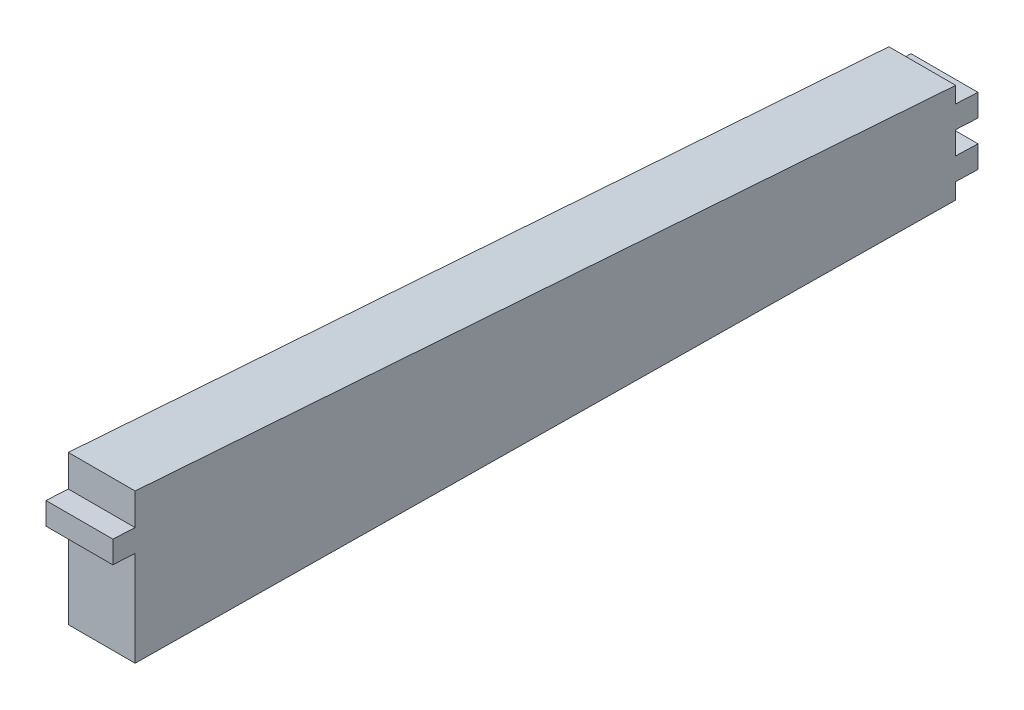
ISO-10303-21;
HEADER;
FILE_DESCRIPTION(('STEP AP214'),'2;1');
FILE_NAME('part.step','',(''),(''),'','','');
FILE_SCHEMA(('AUTOMOTIVE_DESIGN { 1 0 10303 214 1 1 1 1 }'));
ENDSEC;
DATA;
#1=APPLICATION_CONTEXT('core data for automotive mechanical design processes');
#2=APPLICATION_PROTOCOL_DEFINITION('international standard','automotive_design',2000,#1);
#3=PRODUCT_CONTEXT('',#1,'mechanical');
#4=PRODUCT('Part','Part','',(#3));
#5=PRODUCT_RELATED_PRODUCT_CATEGORY('part','',(#4));
#6=PRODUCT_DEFINITION_FORMATION('','',#4);
#7=PRODUCT_DEFINITION_CONTEXT('part definition',#1,'design');
#8=PRODUCT_DEFINITION('design','',#6,#7);
#9=PRODUCT_DEFINITION_SHAPE('','',#8);
#10=(LENGTH_UNIT() NAMED_UNIT(*) SI_UNIT(.MILLI.,.METRE.));
#11=(NAMED_UNIT(*) PLANE_ANGLE_UNIT() SI_UNIT($,.RADIAN.));
#12=(NAMED_UNIT(*) SI_UNIT($,.STERADIAN.) SOLID_ANGLE_UNIT());
#13=UNCERTAINTY_MEASURE_WITH_UNIT(LENGTH_MEASURE(1.E-05),#10,'distance_accuracy_value','');
#14=(GEOMETRIC_REPRESENTATION_CONTEXT(3) GLOBAL_UNCERTAINTY_ASSIGNED_CONTEXT((#13)) GLOBAL_UNIT_ASSIGNED_CONTEXT((#10,
#11,#12)) REPRESENTATION_CONTEXT('',''));
#15=CARTESIAN_POINT('',(0.,0.,0.));
#16=DIRECTION('',(0.,0.,1.));
#17=DIRECTION('',(1.,0.,0.));
#18=AXIS2_PLACEMENT_3D('',#15,#16,#17);
#19=CARTESIAN_POINT('',(243.017706630707,0.,0.));
#20=DIRECTION('',(1.,0.,0.));
#21=DIRECTION('',(0.,0.,1.));
#22=AXIS2_PLACEMENT_3D('',#19,#20,#21);
#23=PLANE('',#22);
#24=DIRECTION('',(0.,-1.,0.));
#25=VECTOR('',#24,1.);
#26=CARTESIAN_POINT('',(243.017706630707,353.831713156152,-1497.60619407791));
#27=LINE('',#26,#25);
#28=CARTESIAN_POINT('',(243.017706630707,356.11488737901,-1497.60619407791));
#29=VERTEX_POINT('',#28);
#30=CARTESIAN_POINT('',(243.017706630707,353.831713156152,-1497.60619407791));
#31=VERTEX_POINT('',#30);
#32=EDGE_CURVE('E152',#29,#31,#27,.T.);
#33=ORIENTED_EDGE('',*,*,#32,.T.);
#34=DIRECTION('',(0.,0.011191896188366,0.999937368768519));
#35=VECTOR('',#34,1.);
#36=CARTESIAN_POINT('',(243.017706630707,355.140640763176,-1380.66036065991));
#37=LINE('',#36,#35);
#38=CARTESIAN_POINT('',(243.017706630707,355.140640763176,-1380.66036065991));
#39=VERTEX_POINT('',#38);
#40=EDGE_CURVE('E155',#31,#39,#37,.T.);
#41=ORIENTED_EDGE('',*,*,#40,.T.);
#42=DIRECTION('',(0.,1.,0.));
#43=VECTOR('',#42,1.);
#44=CARTESIAN_POINT('',(243.017706630707,355.140640763176,-1380.66036065991));
#45=LINE('',#44,#43);
#46=CARTESIAN_POINT('',(243.017706630707,368.709177990206,-1380.66036065991));
#47=VERTEX_POINT('',#46);
#48=EDGE_CURVE('E160',#39,#47,#45,.T.);
#49=ORIENTED_EDGE('',*,*,#48,.T.);
#50=DIRECTION('',(0.,0.0527109798388475,0.99860980998808));
#51=VECTOR('',#50,1.);
#52=CARTESIAN_POINT('',(243.017706630707,368.709177990206,-1380.66036065991));
#53=LINE('',#52,#51);
#54=CARTESIAN_POINT('',(243.017706630707,368.876768333616,-1377.48536065991));
#55=VERTEX_POINT('',#54);
#56=EDGE_CURVE('E170',#47,#55,#53,.T.);
#57=ORIENTED_EDGE('',*,*,#56,.T.);
#58=DIRECTION('',(0.,1.,0.));
#59=VECTOR('',#58,1.);
#60=CARTESIAN_POINT('',(243.017706630707,368.876768333616,-1377.48536065991));
#61=LINE('',#60,#59);
#62=CARTESIAN_POINT('',(243.017706630707,372.051768333616,-1377.48536065991));
#63=VERTEX_POINT('',#62);
#64=EDGE_CURVE('E173',#55,#63,#61,.T.);
#65=ORIENTED_EDGE('',*,*,#64,.T.);
#66=DIRECTION('',(0.,-0.0527109798388475,-0.99860980998808));
#67=VECTOR('',#66,1.);
#68=CARTESIAN_POINT('',(243.017706630707,372.051768333616,-1377.48536065991));
#69=LINE('',#68,#67);
#70=CARTESIAN_POINT('',(243.017706630707,371.884177990206,-1380.66036065991));
#71=VERTEX_POINT('',#70);
#72=EDGE_CURVE('E176',#63,#71,#69,.T.);
#73=ORIENTED_EDGE('',*,*,#72,.T.);
#74=DIRECTION('',(0.,1.,0.));
#75=VECTOR('',#74,1.);
#76=CARTESIAN_POINT('',(243.017706630707,376.402186089953,-1380.66036065991));
#77=LINE('',#76,#75);
#78=CARTESIAN_POINT('',(243.017706630707,376.402186089953,-1380.66036065991));
#79=VERTEX_POINT('',#78);
#80=EDGE_CURVE('E179',#71,#79,#77,.T.);
#81=ORIENTED_EDGE('',*,*,#80,.T.);
#82=DIRECTION('',(0.,-0.071709265095427,-0.997425576822388));
#83=VECTOR('',#82,1.);
#84=CARTESIAN_POINT('',(243.017706630707,367.994441226327,-1497.60619407791));
#85=LINE('',#84,#83);
#86=CARTESIAN_POINT('',(243.017706630707,367.994441226327,-1497.60619407791));
#87=VERTEX_POINT('',#86);
#88=EDGE_CURVE('E182',#79,#87,#85,.T.);
#89=ORIENTED_EDGE('',*,*,#88,.T.);
#90=DIRECTION('',(0.,-1.,0.));
#91=VECTOR('',#90,1.);
#92=CARTESIAN_POINT('',(243.017706630707,365.711267003469,-1497.60619407791));
#93=LINE('',#92,#91);
#94=CARTESIAN_POINT('',(243.017706630707,365.711267003469,-1497.60619407791));
#95=VERTEX_POINT('',#94);
#96=EDGE_CURVE('E185',#87,#95,#93,.T.);
#97=ORIENTED_EDGE('',*,*,#96,.T.);
#98=DIRECTION('',(0.,-0.0527109798388548,-0.998609809988079));
#99=VECTOR('',#98,1.);
#100=CARTESIAN_POINT('',(243.017706630707,365.711267003469,-1497.60619407791));
#101=LINE('',#100,#99);
#102=CARTESIAN_POINT('',(243.017706630707,365.543676660059,-1500.78119407791));
#103=VERTEX_POINT('',#102);
#104=EDGE_CURVE('E188',#95,#103,#101,.T.);
#105=ORIENTED_EDGE('',*,*,#104,.T.);
#106=DIRECTION('',(0.,-1.,0.));
#107=VECTOR('',#106,1.);
#108=CARTESIAN_POINT('',(243.017706630707,365.543676660059,-1500.78119407791));
#109=LINE('',#108,#107);
#110=CARTESIAN_POINT('',(243.017706630707,362.368676660059,-1500.78119407791));
#111=VERTEX_POINT('',#110);
#112=EDGE_CURVE('E191',#103,#111,#109,.T.);
#113=ORIENTED_EDGE('',*,*,#112,.T.);
#114=DIRECTION('',(0.,0.0527109798388548,0.998609809988079));
#115=VECTOR('',#114,1.);
#116=CARTESIAN_POINT('',(243.017706630707,362.368676660059,-1500.78119407791));
#117=LINE('',#116,#115);
#118=CARTESIAN_POINT('',(243.017706630707,362.536267003469,-1497.60619407791));
#119=VERTEX_POINT('',#118);
#120=EDGE_CURVE('E194',#111,#119,#117,.T.);
#121=ORIENTED_EDGE('',*,*,#120,.T.);
#122=DIRECTION('',(0.,-1.,0.));
#123=VECTOR('',#122,1.);
#124=CARTESIAN_POINT('',(243.017706630707,359.28988737901,-1497.60619407791));
#125=LINE('',#124,#123);
#126=CARTESIAN_POINT('',(243.017706630707,359.28988737901,-1497.60619407791));
#127=VERTEX_POINT('',#126);
#128=EDGE_CURVE('E197',#119,#127,#125,.T.);
#129=ORIENTED_EDGE('',*,*,#128,.T.);
#130=DIRECTION('',(0.,-0.0302886855912018,-0.999541192510422));
#131=VECTOR('',#130,1.);
#132=CARTESIAN_POINT('',(243.017706630707,359.28988737901,-1497.60619407791));
#133=LINE('',#132,#131);
#134=CARTESIAN_POINT('',(243.017706630707,359.193676660059,-1500.78119407791));
#135=VERTEX_POINT('',#134);
#136=EDGE_CURVE('E200',#127,#135,#133,.T.);
#137=ORIENTED_EDGE('',*,*,#136,.T.);
#138=DIRECTION('',(0.,-1.,0.));
#139=VECTOR('',#138,1.);
#140=CARTESIAN_POINT('',(243.017706630707,359.193676660059,-1500.78119407791));
#141=LINE('',#140,#139);
#142=CARTESIAN_POINT('',(243.017706630707,356.018676660059,-1500.78119407791));
#143=VERTEX_POINT('',#142);
#144=EDGE_CURVE('E203',#135,#143,#141,.T.);
#145=ORIENTED_EDGE('',*,*,#144,.T.);
#146=DIRECTION('',(0.,0.0302886855912018,0.999541192510422));
#147=VECTOR('',#146,1.);
#148=CARTESIAN_POINT('',(243.017706630707,356.018676660059,-1500.78119407791));
#149=LINE('',#148,#147);
#150=EDGE_CURVE('E165',#143,#29,#149,.T.);
#151=ORIENTED_EDGE('',*,*,#150,.T.);
#152=EDGE_LOOP('',(#33,#41,#49,#57,#65,#73,#81,#89,#97,#105,#113,#121,#129,#137,#145,#151));
#153=FACE_BOUND('',#152,.T.);
#154=ADVANCED_FACE('F35',(#153),#23,.F.);
#155=CARTESIAN_POINT('',(377.887386560469,356.018676660059,-1500.78119407791));
#156=DIRECTION('',(0.,0.999541192510422,-0.0302886855912018));
#157=DIRECTION('',(0.,-0.0302886855912018,-0.999541192510422));
#158=AXIS2_PLACEMENT_3D('',#155,#156,#157);
#159=PLANE('',#158);
#160=DIRECTION('',(-1.,0.,0.));
#161=VECTOR('',#160,1.);
#162=CARTESIAN_POINT('',(377.887386560469,356.11488737901,-1497.60619407791));
#163=LINE('',#162,#161);
#164=CARTESIAN_POINT('',(252.542706630704,356.11488737901,-1497.60619407791));
#165=VERTEX_POINT('',#164);
#166=EDGE_CURVE('E206',#165,#29,#163,.T.);
#167=ORIENTED_EDGE('',*,*,#166,.T.);
#168=ORIENTED_EDGE('',*,*,#150,.F.);
#169=DIRECTION('',(-1.,0.,0.));
#170=VECTOR('',#169,1.);
#171=CARTESIAN_POINT('',(377.887386560469,356.018676660059,-1500.78119407791));
#172=LINE('',#171,#170);
#173=CARTESIAN_POINT('',(252.542706630704,356.018676660059,-1500.78119407791));
#174=VERTEX_POINT('',#173);
#175=EDGE_CURVE('E208',#174,#143,#172,.T.);
#176=ORIENTED_EDGE('',*,*,#175,.F.);
#177=DIRECTION('',(0.,-0.0302886855912018,-0.999541192510423));
#178=VECTOR('',#177,1.);
#179=CARTESIAN_POINT('',(252.542706630704,356.018676660059,-1500.78119407791));
#180=LINE('',#179,#178);
#181=EDGE_CURVE('E39',#165,#174,#180,.T.);
#182=ORIENTED_EDGE('',*,*,#181,.F.);
#183=EDGE_LOOP('',(#167,#168,#176,#182));
#184=FACE_BOUND('',#183,.T.);
#185=ADVANCED_FACE('F306',(#184),#159,.F.);
#186=CARTESIAN_POINT('',(377.887386560469,359.193676660059,-1500.78119407791));
#187=DIRECTION('',(0.,0.,1.));
#188=DIRECTION('',(-1.,0.,0.));
#189=AXIS2_PLACEMENT_3D('',#186,#187,#188);
#190=PLANE('',#189);
#191=ORIENTED_EDGE('',*,*,#175,.T.);
#192=ORIENTED_EDGE('',*,*,#144,.F.);
#193=DIRECTION('',(-1.,0.,0.));
#194=VECTOR('',#193,1.);
#195=CARTESIAN_POINT('',(377.887386560469,359.193676660059,-1500.78119407791));
#196=LINE('',#195,#194);
#197=CARTESIAN_POINT('',(252.542706630704,359.193676660059,-1500.78119407791));
#198=VERTEX_POINT('',#197);
#199=EDGE_CURVE('E210',#198,#135,#196,.T.);
#200=ORIENTED_EDGE('',*,*,#199,.F.);
#201=DIRECTION('',(0.,1.,0.));
#202=VECTOR('',#201,1.);
#203=CARTESIAN_POINT('',(252.542706630704,359.193676660059,-1500.78119407791));
#204=LINE('',#203,#202);
#205=EDGE_CURVE('E302',#174,#198,#204,.T.);
#206=ORIENTED_EDGE('',*,*,#205,.F.);
#207=EDGE_LOOP('',(#191,#192,#200,#206));
#208=FACE_BOUND('',#207,.T.);
#209=ADVANCED_FACE('F300',(#208),#190,.F.);
#210=CARTESIAN_POINT('',(377.887386560469,359.28988737901,-1497.60619407791));
#211=DIRECTION('',(0.,-0.999541192510422,0.0302886855912018));
#212=DIRECTION('',(0.,0.0302886855912018,0.999541192510422));
#213=AXIS2_PLACEMENT_3D('',#210,#211,#212);
#214=PLANE('',#213);
#215=ORIENTED_EDGE('',*,*,#199,.T.);
#216=ORIENTED_EDGE('',*,*,#136,.F.);
#217=DIRECTION('',(-1.,0.,0.));
#218=VECTOR('',#217,1.);
#219=CARTESIAN_POINT('',(377.887386560469,359.28988737901,-1497.60619407791));
#220=LINE('',#219,#218);
#221=CARTESIAN_POINT('',(252.542706630704,359.28988737901,-1497.60619407791));
#222=VERTEX_POINT('',#221);
#223=EDGE_CURVE('E212',#222,#127,#220,.T.);
#224=ORIENTED_EDGE('',*,*,#223,.F.);
#225=DIRECTION('',(0.,0.0302886855912018,0.999541192510423));
#226=VECTOR('',#225,1.);
#227=CARTESIAN_POINT('',(252.542706630704,359.28988737901,-1497.60619407791));
#228=LINE('',#227,#226);
#229=EDGE_CURVE('E297',#198,#222,#228,.T.);
#230=ORIENTED_EDGE('',*,*,#229,.F.);
#231=EDGE_LOOP('',(#215,#216,#224,#230));
#232=FACE_BOUND('',#231,.T.);
#233=ADVANCED_FACE('F294',(#232),#214,.F.);
#234=CARTESIAN_POINT('',(377.887386560469,359.28988737901,-1497.60619407791));
#235=DIRECTION('',(0.,0.,1.));
#236=DIRECTION('',(0.,1.,0.));
#237=AXIS2_PLACEMENT_3D('',#234,#235,#236);
#238=PLANE('',#237);
#239=ORIENTED_EDGE('',*,*,#223,.T.);
#240=ORIENTED_EDGE('',*,*,#128,.F.);
#241=DIRECTION('',(-1.,0.,0.));
#242=VECTOR('',#241,1.);
#243=CARTESIAN_POINT('',(377.887386560469,362.536267003469,-1497.60619407791));
#244=LINE('',#243,#242);
#245=CARTESIAN_POINT('',(252.542706630704,362.536267003469,-1497.60619407791));
#246=VERTEX_POINT('',#245);
#247=EDGE_CURVE('E214',#246,#119,#244,.T.);
#248=ORIENTED_EDGE('',*,*,#247,.F.);
#249=DIRECTION('',(0.,1.,0.));
#250=VECTOR('',#249,1.);
#251=CARTESIAN_POINT('',(252.542706630704,359.28988737901,-1497.60619407791));
#252=LINE('',#251,#250);
#253=EDGE_CURVE('E309',#222,#246,#252,.T.);
#254=ORIENTED_EDGE('',*,*,#253,.F.);
#255=EDGE_LOOP('',(#239,#240,#248,#254));
#256=FACE_BOUND('',#255,.T.);
#257=ADVANCED_FACE('F289',(#256),#238,.F.);
#258=CARTESIAN_POINT('',(377.887386560469,362.368676660059,-1500.78119407791));
#259=DIRECTION('',(0.,0.998609809988079,-0.0527109798388548));
#260=DIRECTION('',(0.,-0.0527109798388549,-0.998609809988079));
#261=AXIS2_PLACEMENT_3D('',#258,#259,#260);
#262=PLANE('',#261);
#263=ORIENTED_EDGE('',*,*,#247,.T.);
#264=ORIENTED_EDGE('',*,*,#120,.F.);
#265=DIRECTION('',(-1.,0.,0.));
#266=VECTOR('',#265,1.);
#267=CARTESIAN_POINT('',(377.887386560469,362.368676660059,-1500.78119407791));
#268=LINE('',#267,#266);
#269=CARTESIAN_POINT('',(252.542706630704,362.368676660059,-1500.78119407791));
#270=VERTEX_POINT('',#269);
#271=EDGE_CURVE('E216',#270,#111,#268,.T.);
#272=ORIENTED_EDGE('',*,*,#271,.F.);
#273=DIRECTION('',(0.,-0.0527109798388549,-0.998609809988079));
#274=VECTOR('',#273,1.);
#275=CARTESIAN_POINT('',(252.542706630704,362.368676660059,-1500.78119407791));
#276=LINE('',#275,#274);
#277=EDGE_CURVE('E286',#246,#270,#276,.T.);
#278=ORIENTED_EDGE('',*,*,#277,.F.);
#279=EDGE_LOOP('',(#263,#264,#272,#278));
#280=FACE_BOUND('',#279,.T.);
#281=ADVANCED_FACE('F283',(#280),#262,.F.);
#282=CARTESIAN_POINT('',(377.887386560469,365.543676660059,-1500.78119407791));
#283=DIRECTION('',(0.,0.,1.));
#284=DIRECTION('',(-1.,0.,0.));
#285=AXIS2_PLACEMENT_3D('',#282,#283,#284);
#286=PLANE('',#285);
#287=ORIENTED_EDGE('',*,*,#271,.T.);
#288=ORIENTED_EDGE('',*,*,#112,.F.);
#289=DIRECTION('',(-1.,0.,0.));
#290=VECTOR('',#289,1.);
#291=CARTESIAN_POINT('',(377.887386560469,365.543676660059,-1500.78119407791));
#292=LINE('',#291,#290);
#293=CARTESIAN_POINT('',(252.542706630704,365.543676660059,-1500.78119407791));
#294=VERTEX_POINT('',#293);
#295=EDGE_CURVE('E218',#294,#103,#292,.T.);
#296=ORIENTED_EDGE('',*,*,#295,.F.);
#297=DIRECTION('',(0.,1.,0.));
#298=VECTOR('',#297,1.);
#299=CARTESIAN_POINT('',(252.542706630704,365.543676660059,-1500.78119407791));
#300=LINE('',#299,#298);
#301=EDGE_CURVE('E280',#270,#294,#300,.T.);
#302=ORIENTED_EDGE('',*,*,#301,.F.);
#303=EDGE_LOOP('',(#287,#288,#296,#302));
#304=FACE_BOUND('',#303,.T.);
#305=ADVANCED_FACE('F277',(#304),#286,.F.);
#306=CARTESIAN_POINT('',(377.887386560469,365.711267003469,-1497.60619407791));
#307=DIRECTION('',(0.,-0.998609809988079,0.0527109798388548));
#308=DIRECTION('',(0.,0.0527109798388549,0.998609809988079));
#309=AXIS2_PLACEMENT_3D('',#306,#307,#308);
#310=PLANE('',#309);
#311=ORIENTED_EDGE('',*,*,#295,.T.);
#312=ORIENTED_EDGE('',*,*,#104,.F.);
#313=DIRECTION('',(-1.,0.,0.));
#314=VECTOR('',#313,1.);
#315=CARTESIAN_POINT('',(377.887386560469,365.711267003469,-1497.60619407791));
#316=LINE('',#315,#314);
#317=CARTESIAN_POINT('',(252.542706630704,365.711267003469,-1497.60619407791));
#318=VERTEX_POINT('',#317);
#319=EDGE_CURVE('E220',#318,#95,#316,.T.);
#320=ORIENTED_EDGE('',*,*,#319,.F.);
#321=DIRECTION('',(0.,0.0527109798388549,0.998609809988079));
#322=VECTOR('',#321,1.);
#323=CARTESIAN_POINT('',(252.542706630704,365.711267003469,-1497.60619407791));
#324=LINE('',#323,#322);
#325=EDGE_CURVE('E315',#294,#318,#324,.T.);
#326=ORIENTED_EDGE('',*,*,#325,.F.);
#327=EDGE_LOOP('',(#311,#312,#320,#326));
#328=FACE_BOUND('',#327,.T.);
#329=ADVANCED_FACE('F272',(#328),#310,.F.);
#330=CARTESIAN_POINT('',(377.887386560469,365.711267003469,-1497.60619407791));
#331=DIRECTION('',(0.,0.,1.));
#332=DIRECTION('',(0.,1.,0.));
#333=AXIS2_PLACEMENT_3D('',#330,#331,#332);
#334=PLANE('',#333);
#335=ORIENTED_EDGE('',*,*,#319,.T.);
#336=ORIENTED_EDGE('',*,*,#96,.F.);
#337=DIRECTION('',(-1.,0.,0.));
#338=VECTOR('',#337,1.);
#339=CARTESIAN_POINT('',(377.887386560469,367.994441226327,-1497.60619407791));
#340=LINE('',#339,#338);
#341=CARTESIAN_POINT('',(252.542706630704,367.994441226327,-1497.60619407791));
#342=VERTEX_POINT('',#341);
#343=EDGE_CURVE('E222',#342,#87,#340,.T.);
#344=ORIENTED_EDGE('',*,*,#343,.F.);
#345=DIRECTION('',(0.,1.,0.));
#346=VECTOR('',#345,1.);
#347=CARTESIAN_POINT('',(252.542706630704,365.711267003469,-1497.60619407791));
#348=LINE('',#347,#346);
#349=EDGE_CURVE('E269',#318,#342,#348,.T.);
#350=ORIENTED_EDGE('',*,*,#349,.F.);
#351=EDGE_LOOP('',(#335,#336,#344,#350));
#352=FACE_BOUND('',#351,.T.);
#353=ADVANCED_FACE('F266',(#352),#334,.F.);
#354=CARTESIAN_POINT('',(377.887386560469,367.994441226327,-1497.60619407791));
#355=DIRECTION('',(0.,-0.997425576822388,0.071709265095427));
#356=DIRECTION('',(0.,0.071709265095427,0.997425576822388));
#357=AXIS2_PLACEMENT_3D('',#354,#355,#356);
#358=PLANE('',#357);
#359=ORIENTED_EDGE('',*,*,#343,.T.);
#360=ORIENTED_EDGE('',*,*,#88,.F.);
#361=DIRECTION('',(-1.,0.,0.));
#362=VECTOR('',#361,1.);
#363=CARTESIAN_POINT('',(377.887386560469,376.402186089953,-1380.66036065991));
#364=LINE('',#363,#362);
#365=CARTESIAN_POINT('',(252.542706630704,376.402186089953,-1380.66036065991));
#366=VERTEX_POINT('',#365);
#367=EDGE_CURVE('E224',#366,#79,#364,.T.);
#368=ORIENTED_EDGE('',*,*,#367,.F.);
#369=DIRECTION('',(0.,0.071709265095427,0.997425576822388));
#370=VECTOR('',#369,1.);
#371=CARTESIAN_POINT('',(252.542706630704,367.994441226327,-1497.60619407791));
#372=LINE('',#371,#370);
#373=EDGE_CURVE('E263',#342,#366,#372,.T.);
#374=ORIENTED_EDGE('',*,*,#373,.F.);
#375=EDGE_LOOP('',(#359,#360,#368,#374));
#376=FACE_BOUND('',#375,.T.);
#377=ADVANCED_FACE('F260',(#376),#358,.F.);
#378=CARTESIAN_POINT('',(377.887386560469,376.402186089953,-1380.66036065991));
#379=DIRECTION('',(0.,0.,-1.));
#380=DIRECTION('',(1.,0.,0.));
#381=AXIS2_PLACEMENT_3D('',#378,#379,#380);
#382=PLANE('',#381);
#383=ORIENTED_EDGE('',*,*,#367,.T.);
#384=ORIENTED_EDGE('',*,*,#80,.F.);
#385=DIRECTION('',(-1.,0.,0.));
#386=VECTOR('',#385,1.);
#387=CARTESIAN_POINT('',(377.887386560469,371.884177990206,-1380.66036065991));
#388=LINE('',#387,#386);
#389=CARTESIAN_POINT('',(252.542706630704,371.884177990206,-1380.66036065991));
#390=VERTEX_POINT('',#389);
#391=EDGE_CURVE('E226',#390,#71,#388,.T.);
#392=ORIENTED_EDGE('',*,*,#391,.F.);
#393=DIRECTION('',(0.,-1.,0.));
#394=VECTOR('',#393,1.);
#395=CARTESIAN_POINT('',(252.542706630704,376.402186089953,-1380.66036065991));
#396=LINE('',#395,#394);
#397=EDGE_CURVE('E319',#366,#390,#396,.T.);
#398=ORIENTED_EDGE('',*,*,#397,.F.);
#399=EDGE_LOOP('',(#383,#384,#392,#398));
#400=FACE_BOUND('',#399,.T.);
#401=ADVANCED_FACE('F255',(#400),#382,.F.);
#402=CARTESIAN_POINT('',(377.887386560469,372.051768333616,-1377.48536065991));
#403=DIRECTION('',(0.,-0.99860980998808,0.0527109798388475));
#404=DIRECTION('',(0.,0.0527109798388475,0.99860980998808));
#405=AXIS2_PLACEMENT_3D('',#402,#403,#404);
#406=PLANE('',#405);
#407=ORIENTED_EDGE('',*,*,#391,.T.);
#408=ORIENTED_EDGE('',*,*,#72,.F.);
#409=DIRECTION('',(-1.,0.,0.));
#410=VECTOR('',#409,1.);
#411=CARTESIAN_POINT('',(377.887386560469,372.051768333616,-1377.48536065991));
#412=LINE('',#411,#410);
#413=CARTESIAN_POINT('',(252.542706630704,372.051768333616,-1377.48536065991));
#414=VERTEX_POINT('',#413);
#415=EDGE_CURVE('E228',#414,#63,#412,.T.);
#416=ORIENTED_EDGE('',*,*,#415,.F.);
#417=DIRECTION('',(0.,0.0527109798388475,0.99860980998808));
#418=VECTOR('',#417,1.);
#419=CARTESIAN_POINT('',(252.542706630704,372.051768333616,-1377.48536065991));
#420=LINE('',#419,#418);
#421=EDGE_CURVE('E252',#390,#414,#420,.T.);
#422=ORIENTED_EDGE('',*,*,#421,.F.);
#423=EDGE_LOOP('',(#407,#408,#416,#422));
#424=FACE_BOUND('',#423,.T.);
#425=ADVANCED_FACE('F249',(#424),#406,.F.);
#426=CARTESIAN_POINT('',(377.887386560469,368.876768333616,-1377.48536065991));
#427=DIRECTION('',(0.,0.,-1.));
#428=DIRECTION('',(1.,0.,0.));
#429=AXIS2_PLACEMENT_3D('',#426,#427,#428);
#430=PLANE('',#429);
#431=ORIENTED_EDGE('',*,*,#415,.T.);
#432=ORIENTED_EDGE('',*,*,#64,.F.);
#433=DIRECTION('',(-1.,0.,0.));
#434=VECTOR('',#433,1.);
#435=CARTESIAN_POINT('',(377.887386560469,368.876768333616,-1377.48536065991));
#436=LINE('',#435,#434);
#437=CARTESIAN_POINT('',(252.542706630704,368.876768333616,-1377.48536065991));
#438=VERTEX_POINT('',#437);
#439=EDGE_CURVE('E230',#438,#55,#436,.T.);
#440=ORIENTED_EDGE('',*,*,#439,.F.);
#441=DIRECTION('',(0.,-1.,0.));
#442=VECTOR('',#441,1.);
#443=CARTESIAN_POINT('',(252.542706630704,368.876768333616,-1377.48536065991));
#444=LINE('',#443,#442);
#445=EDGE_CURVE('E246',#414,#438,#444,.T.);
#446=ORIENTED_EDGE('',*,*,#445,.F.);
#447=EDGE_LOOP('',(#431,#432,#440,#446));
#448=FACE_BOUND('',#447,.T.);
#449=ADVANCED_FACE('F243',(#448),#430,.F.);
#450=CARTESIAN_POINT('',(377.887386560469,368.709177990206,-1380.66036065991));
#451=DIRECTION('',(0.,0.99860980998808,-0.0527109798388475));
#452=DIRECTION('',(0.,-0.0527109798388475,-0.99860980998808));
#453=AXIS2_PLACEMENT_3D('',#450,#451,#452);
#454=PLANE('',#453);
#455=ORIENTED_EDGE('',*,*,#439,.T.);
#456=ORIENTED_EDGE('',*,*,#56,.F.);
#457=DIRECTION('',(-1.,0.,0.));
#458=VECTOR('',#457,1.);
#459=CARTESIAN_POINT('',(377.887386560469,368.709177990206,-1380.66036065991));
#460=LINE('',#459,#458);
#461=CARTESIAN_POINT('',(252.542706630704,368.709177990206,-1380.66036065991));
#462=VERTEX_POINT('',#461);
#463=EDGE_CURVE('E232',#462,#47,#460,.T.);
#464=ORIENTED_EDGE('',*,*,#463,.F.);
#465=DIRECTION('',(0.,-0.0527109798388475,-0.99860980998808));
#466=VECTOR('',#465,1.);
#467=CARTESIAN_POINT('',(252.542706630704,368.709177990206,-1380.66036065991));
#468=LINE('',#467,#466);
#469=EDGE_CURVE('E323',#438,#462,#468,.T.);
#470=ORIENTED_EDGE('',*,*,#469,.F.);
#471=EDGE_LOOP('',(#455,#456,#464,#470));
#472=FACE_BOUND('',#471,.T.);
#473=ADVANCED_FACE('F238',(#472),#454,.F.);
#474=CARTESIAN_POINT('',(377.887386560469,355.140640763176,-1380.66036065991));
#475=DIRECTION('',(0.,0.,-1.));
#476=DIRECTION('',(1.,0.,0.));
#477=AXIS2_PLACEMENT_3D('',#474,#475,#476);
#478=PLANE('',#477);
#479=ORIENTED_EDGE('',*,*,#463,.T.);
#480=ORIENTED_EDGE('',*,*,#48,.F.);
#481=DIRECTION('',(-1.,0.,0.));
#482=VECTOR('',#481,1.);
#483=CARTESIAN_POINT('',(377.887386560469,355.140640763176,-1380.66036065991));
#484=LINE('',#483,#482);
#485=CARTESIAN_POINT('',(252.542706630704,355.140640763176,-1380.66036065991));
#486=VERTEX_POINT('',#485);
#487=EDGE_CURVE('E153',#486,#39,#484,.T.);
#488=ORIENTED_EDGE('',*,*,#487,.F.);
#489=DIRECTION('',(0.,-1.,0.));
#490=VECTOR('',#489,1.);
#491=CARTESIAN_POINT('',(252.542706630704,355.140640763176,-1380.66036065991));
#492=LINE('',#491,#490);
#493=EDGE_CURVE('E58',#462,#486,#492,.T.);
#494=ORIENTED_EDGE('',*,*,#493,.F.);
#495=EDGE_LOOP('',(#479,#480,#488,#494));
#496=FACE_BOUND('',#495,.T.);
#497=ADVANCED_FACE('F236',(#496),#478,.F.);
#498=CARTESIAN_POINT('',(377.887386560469,355.140640763176,-1380.66036065991));
#499=DIRECTION('',(0.,0.999937368768519,-0.011191896188366));
#500=DIRECTION('',(0.,-0.011191896188366,-0.999937368768519));
#501=AXIS2_PLACEMENT_3D('',#498,#499,#500);
#502=PLANE('',#501);
#503=ORIENTED_EDGE('',*,*,#487,.T.);
#504=ORIENTED_EDGE('',*,*,#40,.F.);
#505=DIRECTION('',(-1.,0.,0.));
#506=VECTOR('',#505,1.);
#507=CARTESIAN_POINT('',(377.887386560469,353.831713156152,-1497.60619407791));
#508=LINE('',#507,#506);
#509=CARTESIAN_POINT('',(252.542706630704,353.831713156152,-1497.60619407791));
#510=VERTEX_POINT('',#509);
#511=EDGE_CURVE('E148',#510,#31,#508,.T.);
#512=ORIENTED_EDGE('',*,*,#511,.F.);
#513=DIRECTION('',(0.,-0.011191896188366,-0.999937368768519));
#514=VECTOR('',#513,1.);
#515=CARTESIAN_POINT('',(252.542706630704,355.140640763176,-1380.66036065991));
#516=LINE('',#515,#514);
#517=EDGE_CURVE('E44',#486,#510,#516,.T.);
#518=ORIENTED_EDGE('',*,*,#517,.F.);
#519=EDGE_LOOP('',(#503,#504,#512,#518));
#520=FACE_BOUND('',#519,.T.);
#521=ADVANCED_FACE('F156',(#520),#502,.F.);
#522=CARTESIAN_POINT('',(377.887386560469,353.831713156152,-1497.60619407791));
#523=DIRECTION('',(0.,0.,1.));
#524=DIRECTION('',(-1.,0.,0.));
#525=AXIS2_PLACEMENT_3D('',#522,#523,#524);
#526=PLANE('',#525);
#527=ORIENTED_EDGE('',*,*,#511,.T.);
#528=ORIENTED_EDGE('',*,*,#32,.F.);
#529=ORIENTED_EDGE('',*,*,#166,.F.);
#530=DIRECTION('',(0.,1.,0.));
#531=VECTOR('',#530,1.);
#532=CARTESIAN_POINT('',(252.542706630704,353.831713156152,-1497.60619407791));
#533=LINE('',#532,#531);
#534=EDGE_CURVE('E11',#510,#165,#533,.T.);
#535=ORIENTED_EDGE('',*,*,#534,.F.);
#536=EDGE_LOOP('',(#527,#528,#529,#535));
#537=FACE_BOUND('',#536,.T.);
#538=ADVANCED_FACE('F37',(#537),#526,.F.);
#539=CARTESIAN_POINT('',(252.542706630704,344.834338896103,-776.88119407791));
#540=DIRECTION('',(-1.,0.,0.));
#541=DIRECTION('',(0.,0.,-1.));
#542=AXIS2_PLACEMENT_3D('',#539,#540,#541);
#543=PLANE('',#542);
#544=ORIENTED_EDGE('',*,*,#517,.T.);
#545=ORIENTED_EDGE('',*,*,#534,.T.);
#546=ORIENTED_EDGE('',*,*,#181,.T.);
#547=ORIENTED_EDGE('',*,*,#205,.T.);
#548=ORIENTED_EDGE('',*,*,#229,.T.);
#549=ORIENTED_EDGE('',*,*,#253,.T.);
#550=ORIENTED_EDGE('',*,*,#277,.T.);
#551=ORIENTED_EDGE('',*,*,#301,.T.);
#552=ORIENTED_EDGE('',*,*,#325,.T.);
#553=ORIENTED_EDGE('',*,*,#349,.T.);
#554=ORIENTED_EDGE('',*,*,#373,.T.);
#555=ORIENTED_EDGE('',*,*,#397,.T.);
#556=ORIENTED_EDGE('',*,*,#421,.T.);
#557=ORIENTED_EDGE('',*,*,#445,.T.);
#558=ORIENTED_EDGE('',*,*,#469,.T.);
#559=ORIENTED_EDGE('',*,*,#493,.T.);
#560=EDGE_LOOP('',(#544,#545,#546,#547,#548,#549,#550,#551,#552,#553,#554,#555,#556,#557,#558,#559));
#561=FACE_BOUND('',#560,.T.);
#562=ADVANCED_FACE('F325',(#561),#543,.F.);
#563=CLOSED_SHELL('',(#154,#185,#209,#233,#257,#281,#305,#329,#353,#377,#401,#425,#449,#473,
#497,#521,#538,#562));
#564=MANIFOLD_SOLID_BREP('B2',#563);
#565=ADVANCED_BREP_SHAPE_REPRESENTATION('',(#18,#564),#14);
#566=SHAPE_DEFINITION_REPRESENTATION(#9,#565);
ENDSEC;
END-ISO-10303-21;
